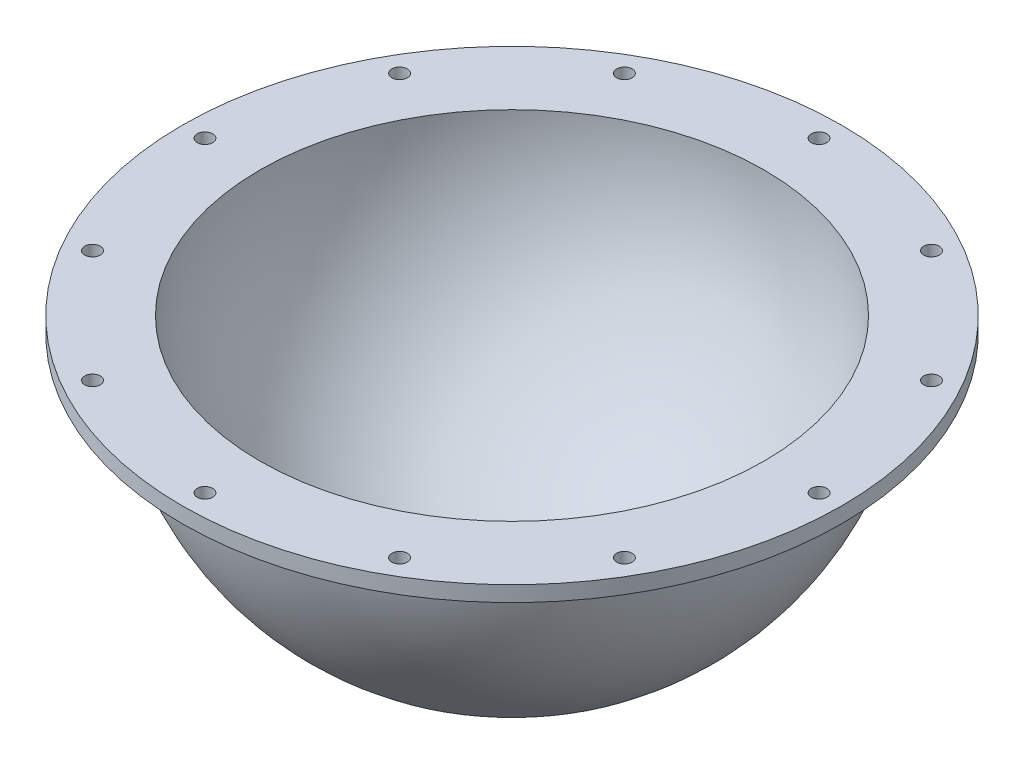
ISO-10303-21;
HEADER;
FILE_DESCRIPTION(('STEP AP214'),'2;1');
FILE_NAME('part.step','',(''),(''),'','','');
FILE_SCHEMA(('AUTOMOTIVE_DESIGN { 1 0 10303 214 1 1 1 1 }'));
ENDSEC;
DATA;
#1=APPLICATION_CONTEXT('core data for automotive mechanical design processes');
#2=APPLICATION_PROTOCOL_DEFINITION('international standard','automotive_design',2000,#1);
#3=PRODUCT_CONTEXT('',#1,'mechanical');
#4=PRODUCT('Part','Part','',(#3));
#5=PRODUCT_RELATED_PRODUCT_CATEGORY('part','',(#4));
#6=PRODUCT_DEFINITION_FORMATION('','',#4);
#7=PRODUCT_DEFINITION_CONTEXT('part definition',#1,'design');
#8=PRODUCT_DEFINITION('design','',#6,#7);
#9=PRODUCT_DEFINITION_SHAPE('','',#8);
#10=(LENGTH_UNIT() NAMED_UNIT(*) SI_UNIT(.MILLI.,.METRE.));
#11=(NAMED_UNIT(*) PLANE_ANGLE_UNIT() SI_UNIT($,.RADIAN.));
#12=(NAMED_UNIT(*) SI_UNIT($,.STERADIAN.) SOLID_ANGLE_UNIT());
#13=UNCERTAINTY_MEASURE_WITH_UNIT(LENGTH_MEASURE(1.E-05),#10,'distance_accuracy_value','');
#14=(GEOMETRIC_REPRESENTATION_CONTEXT(3) GLOBAL_UNCERTAINTY_ASSIGNED_CONTEXT((#13)) GLOBAL_UNIT_ASSIGNED_CONTEXT((#10,
#11,#12)) REPRESENTATION_CONTEXT('',''));
#15=CARTESIAN_POINT('',(0.,0.,0.));
#16=DIRECTION('',(0.,0.,1.));
#17=DIRECTION('',(1.,0.,0.));
#18=AXIS2_PLACEMENT_3D('',#15,#16,#17);
#19=CARTESIAN_POINT('',(1.61653377487451E-13,0.,0.));
#20=DIRECTION('',(0.,0.,-1.));
#21=DIRECTION('',(-1.,0.,0.));
#22=AXIS2_PLACEMENT_3D('',#19,#20,#21);
#23=SPHERICAL_SURFACE('',#22,195.);
#24=CARTESIAN_POINT('',(1.61653377487451E-13,0.,0.));
#25=DIRECTION('',(0.,1.,0.));
#26=DIRECTION('',(0.,0.,1.));
#27=AXIS2_PLACEMENT_3D('',#24,#25,#26);
#28=SPHERICAL_SURFACE('',#27,195.);
#29=CARTESIAN_POINT('',(1.61653377487451E-13,0.,0.));
#30=DIRECTION('',(0.,1.,0.));
#31=DIRECTION('',(0.,0.,1.));
#32=AXIS2_PLACEMENT_3D('',#29,#30,#31);
#33=CIRCLE('',#32,195.);
#34=CARTESIAN_POINT('',(1.61653377487451E-13,0.,195.));
#35=VERTEX_POINT('',#34);
#36=EDGE_CURVE('E10',#35,#35,#33,.T.);
#37=ORIENTED_EDGE('',*,*,#36,.T.);
#38=EDGE_LOOP('',(#37));
#39=FACE_BOUND('',#38,.T.);
#40=ADVANCED_FACE('F31',(#39),#28,.F.);
#41=CARTESIAN_POINT('',(1.61653377487451E-13,0.,0.));
#42=DIRECTION('',(0.,-1.,0.));
#43=DIRECTION('',(0.,0.,1.));
#44=AXIS2_PLACEMENT_3D('',#41,#42,#43);
#45=PLANE('',#44);
#46=CARTESIAN_POINT('',(0.,0.,-237.5));
#47=DIRECTION('',(0.,1.,0.));
#48=DIRECTION('',(-1.,0.,0.));
#49=AXIS2_PLACEMENT_3D('',#46,#47,#48);
#50=CIRCLE('',#49,6.00000000000001);
#51=CARTESIAN_POINT('',(-6.00000000000001,0.,-237.5));
#52=VERTEX_POINT('',#51);
#53=EDGE_CURVE('E52',#52,#52,#50,.T.);
#54=ORIENTED_EDGE('',*,*,#53,.F.);
#55=EDGE_LOOP('',(#54));
#56=FACE_BOUND('',#55,.T.);
#57=CARTESIAN_POINT('',(118.75,8.29226817975247E-13,-205.681033398804));
#58=DIRECTION('',(0.,1.,0.));
#59=DIRECTION('',(-1.,0.,0.));
#60=AXIS2_PLACEMENT_3D('',#57,#58,#59);
#61=CIRCLE('',#60,6.00000000000002);
#62=CARTESIAN_POINT('',(112.75,7.8732904190913E-13,-205.681033398804));
#63=VERTEX_POINT('',#62);
#64=EDGE_CURVE('E117',#63,#63,#61,.T.);
#65=ORIENTED_EDGE('',*,*,#64,.F.);
#66=EDGE_LOOP('',(#65));
#67=FACE_BOUND('',#66,.T.);
#68=CARTESIAN_POINT('',(205.681033398805,1.4362629797318E-12,-118.75));
#69=DIRECTION('',(0.,1.,0.));
#70=DIRECTION('',(-1.,0.,0.));
#71=AXIS2_PLACEMENT_3D('',#68,#69,#70);
#72=CIRCLE('',#71,5.99999999999999);
#73=CARTESIAN_POINT('',(199.681033398805,1.39436520366568E-12,-118.75));
#74=VERTEX_POINT('',#73);
#75=EDGE_CURVE('E120',#74,#74,#72,.T.);
#76=ORIENTED_EDGE('',*,*,#75,.F.);
#77=EDGE_LOOP('',(#76));
#78=FACE_BOUND('',#77,.T.);
#79=CARTESIAN_POINT('',(237.500000000001,1.65845363595049E-12,5.34656556973161E-13));
#80=DIRECTION('',(0.,1.,0.));
#81=DIRECTION('',(-1.,0.,0.));
#82=AXIS2_PLACEMENT_3D('',#79,#80,#81);
#83=CIRCLE('',#82,5.99999999999999);
#84=CARTESIAN_POINT('',(231.500000000001,1.61655585988438E-12,5.34656556973161E-13));
#85=VERTEX_POINT('',#84);
#86=EDGE_CURVE('E109',#85,#85,#83,.T.);
#87=ORIENTED_EDGE('',*,*,#86,.F.);
#88=EDGE_LOOP('',(#87));
#89=FACE_BOUND('',#88,.T.);
#90=CARTESIAN_POINT('',(-118.75,-8.29226817975246E-13,-205.681033398804));
#91=DIRECTION('',(0.,1.,0.));
#92=DIRECTION('',(-1.,0.,0.));
#93=AXIS2_PLACEMENT_3D('',#90,#91,#92);
#94=CIRCLE('',#93,5.99999999999999);
#95=CARTESIAN_POINT('',(-124.75,-8.71124594041364E-13,-205.681033398804));
#96=VERTEX_POINT('',#95);
#97=EDGE_CURVE('E102',#96,#96,#94,.T.);
#98=ORIENTED_EDGE('',*,*,#97,.F.);
#99=EDGE_LOOP('',(#98));
#100=FACE_BOUND('',#99,.T.);
#101=CARTESIAN_POINT('',(-205.681033398805,-1.4362629797318E-12,-118.75));
#102=DIRECTION('',(0.,1.,0.));
#103=DIRECTION('',(-1.,0.,0.));
#104=AXIS2_PLACEMENT_3D('',#101,#102,#103);
#105=CIRCLE('',#104,5.99999999999999);
#106=CARTESIAN_POINT('',(-211.681033398805,-1.47816075579791E-12,-118.75));
#107=VERTEX_POINT('',#106);
#108=EDGE_CURVE('E99',#107,#107,#105,.T.);
#109=ORIENTED_EDGE('',*,*,#108,.F.);
#110=EDGE_LOOP('',(#109));
#111=FACE_BOUND('',#110,.T.);
#112=CARTESIAN_POINT('',(-237.5,-1.65845363595049E-12,6.65310780835268E-13));
#113=DIRECTION('',(0.,1.,0.));
#114=DIRECTION('',(-1.,0.,0.));
#115=AXIS2_PLACEMENT_3D('',#112,#113,#114);
#116=CIRCLE('',#115,5.99999999999999);
#117=CARTESIAN_POINT('',(-243.5,-1.70035141201661E-12,6.65310780835268E-13));
#118=VERTEX_POINT('',#117);
#119=EDGE_CURVE('E95',#118,#118,#116,.T.);
#120=ORIENTED_EDGE('',*,*,#119,.F.);
#121=EDGE_LOOP('',(#120));
#122=FACE_BOUND('',#121,.T.);
#123=CARTESIAN_POINT('',(-205.681033398805,-1.43626297973179E-12,118.750000000001));
#124=DIRECTION('',(0.,1.,0.));
#125=DIRECTION('',(-1.,0.,0.));
#126=AXIS2_PLACEMENT_3D('',#123,#124,#125);
#127=CIRCLE('',#126,5.99999999999999);
#128=CARTESIAN_POINT('',(-211.681033398805,-1.47816075579791E-12,118.750000000001));
#129=VERTEX_POINT('',#128);
#130=EDGE_CURVE('E92',#129,#129,#127,.T.);
#131=ORIENTED_EDGE('',*,*,#130,.F.);
#132=EDGE_LOOP('',(#131));
#133=FACE_BOUND('',#132,.T.);
#134=CARTESIAN_POINT('',(-118.75,-8.29226817975245E-13,205.681033398805));
#135=DIRECTION('',(0.,1.,0.));
#136=DIRECTION('',(-1.,0.,0.));
#137=AXIS2_PLACEMENT_3D('',#134,#135,#136);
#138=CIRCLE('',#137,6.00000000000008);
#139=CARTESIAN_POINT('',(-124.75,-8.71124594041364E-13,205.681033398805));
#140=VERTEX_POINT('',#139);
#141=EDGE_CURVE('E96',#140,#140,#138,.T.);
#142=ORIENTED_EDGE('',*,*,#141,.F.);
#143=EDGE_LOOP('',(#142));
#144=FACE_BOUND('',#143,.T.);
#145=CARTESIAN_POINT('',(1.59739585341857E-13,0.,237.500000000001));
#146=DIRECTION('',(0.,1.,0.));
#147=DIRECTION('',(-1.,0.,0.));
#148=AXIS2_PLACEMENT_3D('',#145,#146,#147);
#149=CIRCLE('',#148,6.00000000000001);
#150=CARTESIAN_POINT('',(-5.99999999999985,0.,237.500000000001));
#151=VERTEX_POINT('',#150);
#152=EDGE_CURVE('E112',#151,#151,#149,.T.);
#153=ORIENTED_EDGE('',*,*,#152,.F.);
#154=EDGE_LOOP('',(#153));
#155=FACE_BOUND('',#154,.T.);
#156=CARTESIAN_POINT('',(118.75,8.29226817975247E-13,205.681033398805));
#157=DIRECTION('',(0.,1.,0.));
#158=DIRECTION('',(-1.,0.,0.));
#159=AXIS2_PLACEMENT_3D('',#156,#157,#158);
#160=CIRCLE('',#159,5.99999999999999);
#161=CARTESIAN_POINT('',(112.75,7.87329041909129E-13,205.681033398805));
#162=VERTEX_POINT('',#161);
#163=EDGE_CURVE('E108',#162,#162,#160,.T.);
#164=ORIENTED_EDGE('',*,*,#163,.F.);
#165=EDGE_LOOP('',(#164));
#166=FACE_BOUND('',#165,.T.);
#167=CARTESIAN_POINT('',(205.681033398805,1.4362629797318E-12,118.750000000001));
#168=DIRECTION('',(0.,1.,0.));
#169=DIRECTION('',(-1.,0.,0.));
#170=AXIS2_PLACEMENT_3D('',#167,#168,#169);
#171=CIRCLE('',#170,5.99999999999999);
#172=CARTESIAN_POINT('',(199.681033398805,1.39436520366568E-12,118.750000000001));
#173=VERTEX_POINT('',#172);
#174=EDGE_CURVE('E105',#173,#173,#171,.T.);
#175=ORIENTED_EDGE('',*,*,#174,.F.);
#176=EDGE_LOOP('',(#175));
#177=FACE_BOUND('',#176,.T.);
#178=ORIENTED_EDGE('',*,*,#36,.F.);
#179=EDGE_LOOP('',(#178));
#180=FACE_BOUND('',#179,.T.);
#181=CARTESIAN_POINT('',(0.,0.,0.));
#182=DIRECTION('',(0.,-1.,0.));
#183=DIRECTION('',(0.,0.,-1.));
#184=AXIS2_PLACEMENT_3D('',#181,#182,#183);
#185=CIRCLE('',#184,255.);
#186=CARTESIAN_POINT('',(0.,0.,-255.));
#187=VERTEX_POINT('',#186);
#188=EDGE_CURVE('E39',#187,#187,#185,.T.);
#189=ORIENTED_EDGE('',*,*,#188,.F.);
#190=EDGE_LOOP('',(#189));
#191=FACE_BOUND('',#190,.T.);
#192=ADVANCED_FACE('F131',(#56,#67,#78,#89,#100,#111,#122,#133,#144,#155,#166,#177,#180,#191),
#45,.F.);
#193=CARTESIAN_POINT('',(0.,0.,0.));
#194=DIRECTION('',(0.,-1.,0.));
#195=DIRECTION('',(0.,0.,-1.));
#196=AXIS2_PLACEMENT_3D('',#193,#194,#195);
#197=CYLINDRICAL_SURFACE('',#196,255.);
#198=CARTESIAN_POINT('',(0.,-12.,0.));
#199=DIRECTION('',(0.,-1.,0.));
#200=DIRECTION('',(0.,0.,-1.));
#201=AXIS2_PLACEMENT_3D('',#198,#199,#200);
#202=CIRCLE('',#201,255.);
#203=CARTESIAN_POINT('',(0.,-12.,-255.));
#204=VERTEX_POINT('',#203);
#205=EDGE_CURVE('E44',#204,#204,#202,.T.);
#206=ORIENTED_EDGE('',*,*,#205,.F.);
#207=EDGE_LOOP('',(#206));
#208=FACE_BOUND('',#207,.T.);
#209=ORIENTED_EDGE('',*,*,#188,.T.);
#210=EDGE_LOOP('',(#209));
#211=FACE_BOUND('',#210,.T.);
#212=ADVANCED_FACE('F134',(#208,#211),#197,.T.);
#213=CARTESIAN_POINT('',(0.,-12.,255.));
#214=DIRECTION('',(0.,1.,0.));
#215=DIRECTION('',(0.,0.,1.));
#216=AXIS2_PLACEMENT_3D('',#213,#214,#215);
#217=PLANE('',#216);
#218=CARTESIAN_POINT('',(0.,-12.,-237.5));
#219=DIRECTION('',(0.,1.,0.));
#220=DIRECTION('',(0.,0.,1.));
#221=AXIS2_PLACEMENT_3D('',#218,#219,#220);
#222=CIRCLE('',#221,6.00000000000001);
#223=CARTESIAN_POINT('',(0.,-12.,-231.5));
#224=VERTEX_POINT('',#223);
#225=EDGE_CURVE('E35',#224,#224,#222,.T.);
#226=ORIENTED_EDGE('',*,*,#225,.T.);
#227=EDGE_LOOP('',(#226));
#228=FACE_BOUND('',#227,.T.);
#229=CARTESIAN_POINT('',(118.750000000001,-12.,-205.681033398804));
#230=DIRECTION('',(0.,1.,0.));
#231=DIRECTION('',(0.,0.,1.));
#232=AXIS2_PLACEMENT_3D('',#229,#230,#231);
#233=CIRCLE('',#232,6.00000000000002);
#234=CARTESIAN_POINT('',(118.750000000001,-12.,-199.681033398804));
#235=VERTEX_POINT('',#234);
#236=EDGE_CURVE('E78',#235,#235,#233,.T.);
#237=ORIENTED_EDGE('',*,*,#236,.T.);
#238=EDGE_LOOP('',(#237));
#239=FACE_BOUND('',#238,.T.);
#240=CARTESIAN_POINT('',(205.681033398805,-12.,-118.75));
#241=DIRECTION('',(0.,1.,0.));
#242=DIRECTION('',(0.,0.,1.));
#243=AXIS2_PLACEMENT_3D('',#240,#241,#242);
#244=CIRCLE('',#243,5.99999999999999);
#245=CARTESIAN_POINT('',(205.681033398805,-12.,-112.75));
#246=VERTEX_POINT('',#245);
#247=EDGE_CURVE('E76',#246,#246,#244,.T.);
#248=ORIENTED_EDGE('',*,*,#247,.T.);
#249=EDGE_LOOP('',(#248));
#250=FACE_BOUND('',#249,.T.);
#251=CARTESIAN_POINT('',(237.500000000001,-12.,5.34656556973161E-13));
#252=DIRECTION('',(0.,1.,0.));
#253=DIRECTION('',(0.,0.,1.));
#254=AXIS2_PLACEMENT_3D('',#251,#252,#253);
#255=CIRCLE('',#254,5.99999999999999);
#256=CARTESIAN_POINT('',(237.500000000001,-12.,6.00000000000052));
#257=VERTEX_POINT('',#256);
#258=EDGE_CURVE('E73',#257,#257,#255,.T.);
#259=ORIENTED_EDGE('',*,*,#258,.T.);
#260=EDGE_LOOP('',(#259));
#261=FACE_BOUND('',#260,.T.);
#262=CARTESIAN_POINT('',(-118.75,-12.,-205.681033398804));
#263=DIRECTION('',(0.,1.,0.));
#264=DIRECTION('',(0.,0.,1.));
#265=AXIS2_PLACEMENT_3D('',#262,#263,#264);
#266=CIRCLE('',#265,5.99999999999999);
#267=CARTESIAN_POINT('',(-118.75,-12.,-199.681033398804));
#268=VERTEX_POINT('',#267);
#269=EDGE_CURVE('E70',#268,#268,#266,.T.);
#270=ORIENTED_EDGE('',*,*,#269,.T.);
#271=EDGE_LOOP('',(#270));
#272=FACE_BOUND('',#271,.T.);
#273=CARTESIAN_POINT('',(-205.681033398805,-12.,-118.75));
#274=DIRECTION('',(0.,1.,0.));
#275=DIRECTION('',(0.,0.,1.));
#276=AXIS2_PLACEMENT_3D('',#273,#274,#275);
#277=CIRCLE('',#276,5.99999999999999);
#278=CARTESIAN_POINT('',(-205.681033398805,-12.,-112.75));
#279=VERTEX_POINT('',#278);
#280=EDGE_CURVE('E67',#279,#279,#277,.T.);
#281=ORIENTED_EDGE('',*,*,#280,.T.);
#282=EDGE_LOOP('',(#281));
#283=FACE_BOUND('',#282,.T.);
#284=CARTESIAN_POINT('',(-237.5,-12.,6.65310780835268E-13));
#285=DIRECTION('',(0.,1.,0.));
#286=DIRECTION('',(0.,0.,1.));
#287=AXIS2_PLACEMENT_3D('',#284,#285,#286);
#288=CIRCLE('',#287,5.99999999999999);
#289=CARTESIAN_POINT('',(-237.5,-12.,6.00000000000065));
#290=VERTEX_POINT('',#289);
#291=EDGE_CURVE('E64',#290,#290,#288,.T.);
#292=ORIENTED_EDGE('',*,*,#291,.T.);
#293=EDGE_LOOP('',(#292));
#294=FACE_BOUND('',#293,.T.);
#295=CARTESIAN_POINT('',(-205.681033398804,-12.,118.750000000001));
#296=DIRECTION('',(0.,1.,0.));
#297=DIRECTION('',(0.,0.,1.));
#298=AXIS2_PLACEMENT_3D('',#295,#296,#297);
#299=CIRCLE('',#298,5.99999999999999);
#300=CARTESIAN_POINT('',(-205.681033398804,-12.,124.750000000001));
#301=VERTEX_POINT('',#300);
#302=EDGE_CURVE('E61',#301,#301,#299,.T.);
#303=ORIENTED_EDGE('',*,*,#302,.T.);
#304=EDGE_LOOP('',(#303));
#305=FACE_BOUND('',#304,.T.);
#306=CARTESIAN_POINT('',(-118.75,-12.,205.681033398805));
#307=DIRECTION('',(0.,1.,0.));
#308=DIRECTION('',(0.,0.,1.));
#309=AXIS2_PLACEMENT_3D('',#306,#307,#308);
#310=CIRCLE('',#309,6.00000000000008);
#311=CARTESIAN_POINT('',(-118.75,-12.,211.681033398805));
#312=VERTEX_POINT('',#311);
#313=EDGE_CURVE('E58',#312,#312,#310,.T.);
#314=ORIENTED_EDGE('',*,*,#313,.T.);
#315=EDGE_LOOP('',(#314));
#316=FACE_BOUND('',#315,.T.);
#317=CARTESIAN_POINT('',(2.43535137474092E-13,-12.,237.500000000001));
#318=DIRECTION('',(0.,1.,0.));
#319=DIRECTION('',(0.,0.,1.));
#320=AXIS2_PLACEMENT_3D('',#317,#318,#319);
#321=CIRCLE('',#320,6.00000000000001);
#322=CARTESIAN_POINT('',(2.43535137474092E-13,-12.,243.500000000001));
#323=VERTEX_POINT('',#322);
#324=EDGE_CURVE('E55',#323,#323,#321,.T.);
#325=ORIENTED_EDGE('',*,*,#324,.T.);
#326=EDGE_LOOP('',(#325));
#327=FACE_BOUND('',#326,.T.);
#328=CARTESIAN_POINT('',(118.75,-12.,205.681033398805));
#329=DIRECTION('',(0.,1.,0.));
#330=DIRECTION('',(0.,0.,1.));
#331=AXIS2_PLACEMENT_3D('',#328,#329,#330);
#332=CIRCLE('',#331,5.99999999999999);
#333=CARTESIAN_POINT('',(118.75,-12.,211.681033398805));
#334=VERTEX_POINT('',#333);
#335=EDGE_CURVE('E51',#334,#334,#332,.T.);
#336=ORIENTED_EDGE('',*,*,#335,.T.);
#337=EDGE_LOOP('',(#336));
#338=FACE_BOUND('',#337,.T.);
#339=CARTESIAN_POINT('',(205.681033398805,-12.,118.750000000001));
#340=DIRECTION('',(0.,1.,0.));
#341=DIRECTION('',(0.,0.,1.));
#342=AXIS2_PLACEMENT_3D('',#339,#340,#341);
#343=CIRCLE('',#342,5.99999999999999);
#344=CARTESIAN_POINT('',(205.681033398805,-12.,124.750000000001));
#345=VERTEX_POINT('',#344);
#346=EDGE_CURVE('E48',#345,#345,#343,.T.);
#347=ORIENTED_EDGE('',*,*,#346,.T.);
#348=EDGE_LOOP('',(#347));
#349=FACE_BOUND('',#348,.T.);
#350=CARTESIAN_POINT('',(0.,-12.,0.));
#351=DIRECTION('',(0.,-1.,0.));
#352=DIRECTION('',(0.,0.,-1.));
#353=AXIS2_PLACEMENT_3D('',#350,#351,#352);
#354=CIRCLE('',#353,219.672483483936);
#355=CARTESIAN_POINT('',(0.,-12.,-219.672483483936));
#356=VERTEX_POINT('',#355);
#357=EDGE_CURVE('E83',#356,#356,#354,.T.);
#358=ORIENTED_EDGE('',*,*,#357,.F.);
#359=EDGE_LOOP('',(#358));
#360=FACE_BOUND('',#359,.T.);
#361=ORIENTED_EDGE('',*,*,#205,.T.);
#362=EDGE_LOOP('',(#361));
#363=FACE_BOUND('',#362,.T.);
#364=ADVANCED_FACE('F162',(#228,#239,#250,#261,#272,#283,#294,#305,#316,#327,#338,#349,#360,
#363),#217,.F.);
#365=CARTESIAN_POINT('',(1.61653377487451E-13,0.,0.));
#366=DIRECTION('',(0.,0.,-1.));
#367=DIRECTION('',(-1.,0.,0.));
#368=AXIS2_PLACEMENT_3D('',#365,#366,#367);
#369=SPHERICAL_SURFACE('',#368,220.);
#370=CARTESIAN_POINT('',(1.61653377487451E-13,0.,0.));
#371=DIRECTION('',(0.,-1.,0.));
#372=DIRECTION('',(0.,0.,-1.));
#373=AXIS2_PLACEMENT_3D('',#370,#371,#372);
#374=SPHERICAL_SURFACE('',#373,220.);
#375=ORIENTED_EDGE('',*,*,#357,.T.);
#376=EDGE_LOOP('',(#375));
#377=FACE_BOUND('',#376,.T.);
#378=ADVANCED_FACE('F33',(#377),#374,.T.);
#379=CARTESIAN_POINT('',(205.681033398806,-220.,118.750000000001));
#380=DIRECTION('',(0.,1.,0.));
#381=DIRECTION('',(-1.,0.,0.));
#382=AXIS2_PLACEMENT_3D('',#379,#380,#381);
#383=CYLINDRICAL_SURFACE('',#382,5.99999999999999);
#384=ORIENTED_EDGE('',*,*,#174,.T.);
#385=EDGE_LOOP('',(#384));
#386=FACE_BOUND('',#385,.T.);
#387=ORIENTED_EDGE('',*,*,#346,.F.);
#388=EDGE_LOOP('',(#387));
#389=FACE_BOUND('',#388,.T.);
#390=ADVANCED_FACE('F195',(#386,#389),#383,.F.);
#391=CARTESIAN_POINT('',(118.750000000002,-220.000000000001,205.681033398805));
#392=DIRECTION('',(0.,1.,0.));
#393=DIRECTION('',(-1.,0.,0.));
#394=AXIS2_PLACEMENT_3D('',#391,#392,#393);
#395=CYLINDRICAL_SURFACE('',#394,5.99999999999999);
#396=ORIENTED_EDGE('',*,*,#163,.T.);
#397=EDGE_LOOP('',(#396));
#398=FACE_BOUND('',#397,.T.);
#399=ORIENTED_EDGE('',*,*,#335,.F.);
#400=EDGE_LOOP('',(#399));
#401=FACE_BOUND('',#400,.T.);
#402=ADVANCED_FACE('F199',(#398,#401),#395,.F.);
#403=CARTESIAN_POINT('',(1.69599137443285E-12,-220.000000000002,237.500000000001));
#404=DIRECTION('',(0.,1.,0.));
#405=DIRECTION('',(-1.,0.,0.));
#406=AXIS2_PLACEMENT_3D('',#403,#404,#405);
#407=CYLINDRICAL_SURFACE('',#406,6.00000000000001);
#408=ORIENTED_EDGE('',*,*,#152,.T.);
#409=EDGE_LOOP('',(#408));
#410=FACE_BOUND('',#409,.T.);
#411=ORIENTED_EDGE('',*,*,#324,.F.);
#412=EDGE_LOOP('',(#411));
#413=FACE_BOUND('',#412,.T.);
#414=ADVANCED_FACE('F209',(#410,#413),#407,.F.);
#415=CARTESIAN_POINT('',(-118.749999999999,-220.000000000003,205.681033398805));
#416=DIRECTION('',(0.,1.,0.));
#417=DIRECTION('',(-1.,0.,0.));
#418=AXIS2_PLACEMENT_3D('',#415,#416,#417);
#419=CYLINDRICAL_SURFACE('',#418,6.00000000000008);
#420=ORIENTED_EDGE('',*,*,#141,.T.);
#421=EDGE_LOOP('',(#420));
#422=FACE_BOUND('',#421,.T.);
#423=ORIENTED_EDGE('',*,*,#313,.F.);
#424=EDGE_LOOP('',(#423));
#425=FACE_BOUND('',#424,.T.);
#426=ADVANCED_FACE('F219',(#422,#425),#419,.F.);
#427=CARTESIAN_POINT('',(-205.681033398803,-220.000000000003,118.750000000001));
#428=DIRECTION('',(0.,1.,0.));
#429=DIRECTION('',(-1.,0.,0.));
#430=AXIS2_PLACEMENT_3D('',#427,#428,#429);
#431=CYLINDRICAL_SURFACE('',#430,5.99999999999999);
#432=ORIENTED_EDGE('',*,*,#130,.T.);
#433=EDGE_LOOP('',(#432));
#434=FACE_BOUND('',#433,.T.);
#435=ORIENTED_EDGE('',*,*,#302,.F.);
#436=EDGE_LOOP('',(#435));
#437=FACE_BOUND('',#436,.T.);
#438=ADVANCED_FACE('F229',(#434,#437),#431,.F.);
#439=CARTESIAN_POINT('',(-237.499999999999,-220.000000000003,6.65310780835268E-13));
#440=DIRECTION('',(0.,1.,0.));
#441=DIRECTION('',(-1.,0.,0.));
#442=AXIS2_PLACEMENT_3D('',#439,#440,#441);
#443=CYLINDRICAL_SURFACE('',#442,5.99999999999999);
#444=ORIENTED_EDGE('',*,*,#119,.T.);
#445=EDGE_LOOP('',(#444));
#446=FACE_BOUND('',#445,.T.);
#447=ORIENTED_EDGE('',*,*,#291,.F.);
#448=EDGE_LOOP('',(#447));
#449=FACE_BOUND('',#448,.T.);
#450=ADVANCED_FACE('F239',(#446,#449),#443,.F.);
#451=CARTESIAN_POINT('',(-205.681033398803,-220.000000000003,-118.75));
#452=DIRECTION('',(0.,1.,0.));
#453=DIRECTION('',(-1.,0.,0.));
#454=AXIS2_PLACEMENT_3D('',#451,#452,#453);
#455=CYLINDRICAL_SURFACE('',#454,5.99999999999999);
#456=ORIENTED_EDGE('',*,*,#108,.T.);
#457=EDGE_LOOP('',(#456));
#458=FACE_BOUND('',#457,.T.);
#459=ORIENTED_EDGE('',*,*,#280,.F.);
#460=EDGE_LOOP('',(#459));
#461=FACE_BOUND('',#460,.T.);
#462=ADVANCED_FACE('F249',(#458,#461),#455,.F.);
#463=CARTESIAN_POINT('',(-118.749999999999,-220.000000000003,-205.681033398804));
#464=DIRECTION('',(0.,1.,0.));
#465=DIRECTION('',(-1.,0.,0.));
#466=AXIS2_PLACEMENT_3D('',#463,#464,#465);
#467=CYLINDRICAL_SURFACE('',#466,5.99999999999999);
#468=ORIENTED_EDGE('',*,*,#97,.T.);
#469=EDGE_LOOP('',(#468));
#470=FACE_BOUND('',#469,.T.);
#471=ORIENTED_EDGE('',*,*,#269,.F.);
#472=EDGE_LOOP('',(#471));
#473=FACE_BOUND('',#472,.T.);
#474=ADVANCED_FACE('F259',(#470,#473),#467,.F.);
#475=CARTESIAN_POINT('',(237.500000000002,-220.,5.34656556973161E-13));
#476=DIRECTION('',(0.,1.,0.));
#477=DIRECTION('',(-1.,0.,0.));
#478=AXIS2_PLACEMENT_3D('',#475,#476,#477);
#479=CYLINDRICAL_SURFACE('',#478,5.99999999999999);
#480=ORIENTED_EDGE('',*,*,#86,.T.);
#481=EDGE_LOOP('',(#480));
#482=FACE_BOUND('',#481,.T.);
#483=ORIENTED_EDGE('',*,*,#258,.F.);
#484=EDGE_LOOP('',(#483));
#485=FACE_BOUND('',#484,.T.);
#486=ADVANCED_FACE('F269',(#482,#485),#479,.F.);
#487=CARTESIAN_POINT('',(205.681033398806,-220.,-118.75));
#488=DIRECTION('',(0.,1.,0.));
#489=DIRECTION('',(-1.,0.,0.));
#490=AXIS2_PLACEMENT_3D('',#487,#488,#489);
#491=CYLINDRICAL_SURFACE('',#490,5.99999999999999);
#492=ORIENTED_EDGE('',*,*,#75,.T.);
#493=EDGE_LOOP('',(#492));
#494=FACE_BOUND('',#493,.T.);
#495=ORIENTED_EDGE('',*,*,#247,.F.);
#496=EDGE_LOOP('',(#495));
#497=FACE_BOUND('',#496,.T.);
#498=ADVANCED_FACE('F279',(#494,#497),#491,.F.);
#499=CARTESIAN_POINT('',(118.750000000002,-220.000000000001,-205.681033398804));
#500=DIRECTION('',(0.,1.,0.));
#501=DIRECTION('',(-1.,0.,0.));
#502=AXIS2_PLACEMENT_3D('',#499,#500,#501);
#503=CYLINDRICAL_SURFACE('',#502,6.00000000000002);
#504=ORIENTED_EDGE('',*,*,#64,.T.);
#505=EDGE_LOOP('',(#504));
#506=FACE_BOUND('',#505,.T.);
#507=ORIENTED_EDGE('',*,*,#236,.F.);
#508=EDGE_LOOP('',(#507));
#509=FACE_BOUND('',#508,.T.);
#510=ADVANCED_FACE('F289',(#506,#509),#503,.F.);
#511=CARTESIAN_POINT('',(1.53625178909099E-12,-220.000000000002,-237.5));
#512=DIRECTION('',(0.,1.,0.));
#513=DIRECTION('',(-1.,0.,0.));
#514=AXIS2_PLACEMENT_3D('',#511,#512,#513);
#515=CYLINDRICAL_SURFACE('',#514,6.00000000000001);
#516=ORIENTED_EDGE('',*,*,#53,.T.);
#517=EDGE_LOOP('',(#516));
#518=FACE_BOUND('',#517,.T.);
#519=ORIENTED_EDGE('',*,*,#225,.F.);
#520=EDGE_LOOP('',(#519));
#521=FACE_BOUND('',#520,.T.);
#522=ADVANCED_FACE('F128',(#518,#521),#515,.F.);
#523=CLOSED_SHELL('',(#40,#192,#212,#364,#378,#390,#402,#414,#426,#438,#450,#462,#474,#486,#498,
#510,#522));
#524=MANIFOLD_SOLID_BREP('B2',#523);
#525=ADVANCED_BREP_SHAPE_REPRESENTATION('',(#18,#524),#14);
#526=SHAPE_DEFINITION_REPRESENTATION(#9,#525);
ENDSEC;
END-ISO-10303-21;
